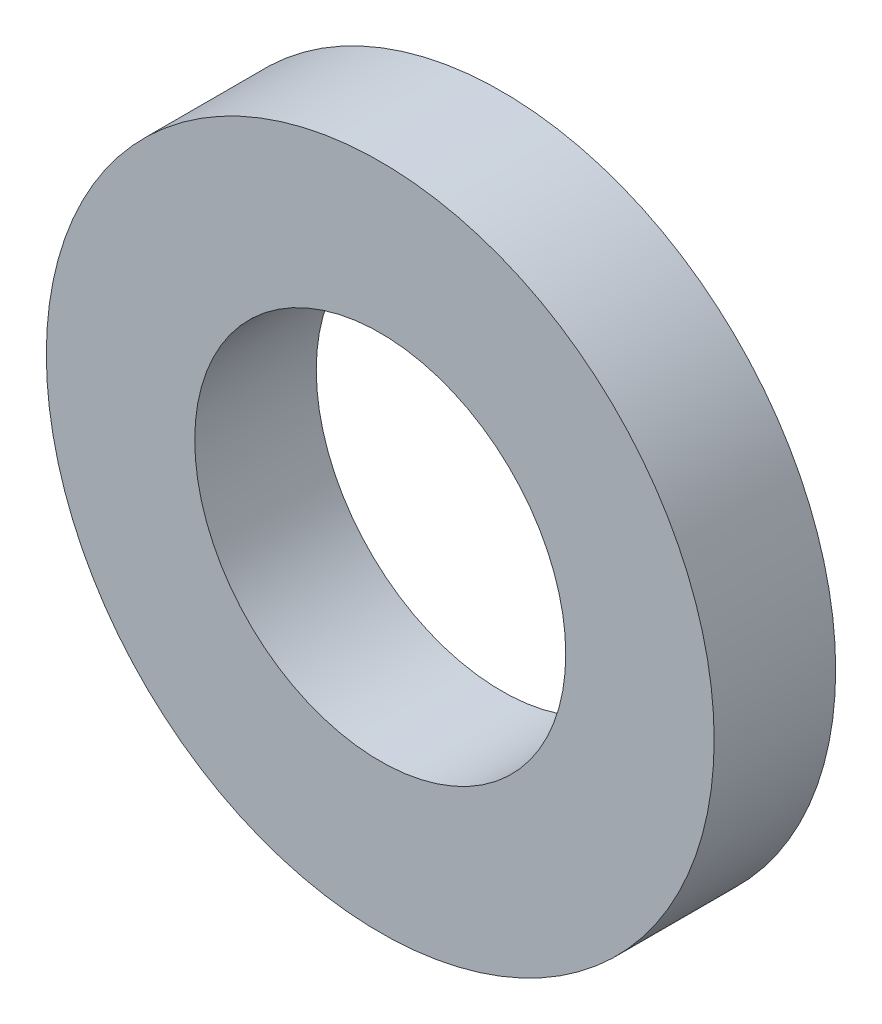
ISO-10303-21;
HEADER;
FILE_DESCRIPTION(('STEP AP214'),'2;1');
FILE_NAME('part.step','',(''),(''),'','','');
FILE_SCHEMA(('AUTOMOTIVE_DESIGN { 1 0 10303 214 1 1 1 1 }'));
ENDSEC;
DATA;
#1=APPLICATION_CONTEXT('core data for automotive mechanical design processes');
#2=APPLICATION_PROTOCOL_DEFINITION('international standard','automotive_design',2000,#1);
#3=PRODUCT_CONTEXT('',#1,'mechanical');
#4=PRODUCT('Part','Part','',(#3));
#5=PRODUCT_RELATED_PRODUCT_CATEGORY('part','',(#4));
#6=PRODUCT_DEFINITION_FORMATION('','',#4);
#7=PRODUCT_DEFINITION_CONTEXT('part definition',#1,'design');
#8=PRODUCT_DEFINITION('design','',#6,#7);
#9=PRODUCT_DEFINITION_SHAPE('','',#8);
#10=(LENGTH_UNIT() NAMED_UNIT(*) SI_UNIT(.MILLI.,.METRE.));
#11=(NAMED_UNIT(*) PLANE_ANGLE_UNIT() SI_UNIT($,.RADIAN.));
#12=(NAMED_UNIT(*) SI_UNIT($,.STERADIAN.) SOLID_ANGLE_UNIT());
#13=UNCERTAINTY_MEASURE_WITH_UNIT(LENGTH_MEASURE(1.E-05),#10,'distance_accuracy_value','');
#14=(GEOMETRIC_REPRESENTATION_CONTEXT(3) GLOBAL_UNCERTAINTY_ASSIGNED_CONTEXT((#13)) GLOBAL_UNIT_ASSIGNED_CONTEXT((#10,
#11,#12)) REPRESENTATION_CONTEXT('',''));
#15=CARTESIAN_POINT('',(0.,0.,0.));
#16=DIRECTION('',(0.,0.,1.));
#17=DIRECTION('',(1.,0.,0.));
#18=AXIS2_PLACEMENT_3D('',#15,#16,#17);
#19=CARTESIAN_POINT('',(0.,0.,0.81875));
#20=DIRECTION('',(0.,0.,1.));
#21=DIRECTION('',(1.,0.,0.));
#22=AXIS2_PLACEMENT_3D('',#19,#20,#21);
#23=PLANE('',#22);
#24=CARTESIAN_POINT('',(0.,0.,0.81875));
#25=DIRECTION('',(0.,0.,1.));
#26=DIRECTION('',(1.,0.,0.));
#27=AXIS2_PLACEMENT_3D('',#24,#25,#26);
#28=CIRCLE('',#27,4.5);
#29=CARTESIAN_POINT('',(4.5,0.,0.81875));
#30=VERTEX_POINT('',#29);
#31=EDGE_CURVE('E10',#30,#30,#28,.T.);
#32=ORIENTED_EDGE('',*,*,#31,.T.);
#33=EDGE_LOOP('',(#32));
#34=FACE_BOUND('',#33,.T.);
#35=CARTESIAN_POINT('',(0.,0.,0.81875));
#36=DIRECTION('',(0.,0.,1.));
#37=DIRECTION('',(1.,0.,0.));
#38=AXIS2_PLACEMENT_3D('',#35,#36,#37);
#39=CIRCLE('',#38,2.5);
#40=CARTESIAN_POINT('',(2.5,0.,0.81875));
#41=VERTEX_POINT('',#40);
#42=EDGE_CURVE('E54',#41,#41,#39,.T.);
#43=ORIENTED_EDGE('',*,*,#42,.F.);
#44=EDGE_LOOP('',(#43));
#45=FACE_BOUND('',#44,.T.);
#46=ADVANCED_FACE('F41',(#34,#45),#23,.T.);
#47=CARTESIAN_POINT('',(0.,0.,-0.81875));
#48=DIRECTION('',(0.,0.,1.));
#49=DIRECTION('',(1.,0.,0.));
#50=AXIS2_PLACEMENT_3D('',#47,#48,#49);
#51=PLANE('',#50);
#52=CARTESIAN_POINT('',(0.,0.,-0.81875));
#53=DIRECTION('',(0.,0.,1.));
#54=DIRECTION('',(1.,0.,0.));
#55=AXIS2_PLACEMENT_3D('',#52,#53,#54);
#56=CIRCLE('',#55,4.5);
#57=CARTESIAN_POINT('',(4.5,0.,-0.81875));
#58=VERTEX_POINT('',#57);
#59=EDGE_CURVE('E45',#58,#58,#56,.T.);
#60=ORIENTED_EDGE('',*,*,#59,.F.);
#61=EDGE_LOOP('',(#60));
#62=FACE_BOUND('',#61,.T.);
#63=CARTESIAN_POINT('',(0.,0.,-0.81875));
#64=DIRECTION('',(0.,0.,1.));
#65=DIRECTION('',(1.,0.,0.));
#66=AXIS2_PLACEMENT_3D('',#63,#64,#65);
#67=CIRCLE('',#66,2.5);
#68=CARTESIAN_POINT('',(2.5,0.,-0.81875));
#69=VERTEX_POINT('',#68);
#70=EDGE_CURVE('E56',#69,#69,#67,.T.);
#71=ORIENTED_EDGE('',*,*,#70,.T.);
#72=EDGE_LOOP('',(#71));
#73=FACE_BOUND('',#72,.T.);
#74=ADVANCED_FACE('F68',(#62,#73),#51,.F.);
#75=CARTESIAN_POINT('',(0.,0.,0.81875));
#76=DIRECTION('',(0.,0.,-1.));
#77=DIRECTION('',(-1.,0.,0.));
#78=AXIS2_PLACEMENT_3D('',#75,#76,#77);
#79=CYLINDRICAL_SURFACE('',#78,4.5);
#80=ORIENTED_EDGE('',*,*,#31,.F.);
#81=EDGE_LOOP('',(#80));
#82=FACE_BOUND('',#81,.T.);
#83=ORIENTED_EDGE('',*,*,#59,.T.);
#84=EDGE_LOOP('',(#83));
#85=FACE_BOUND('',#84,.T.);
#86=ADVANCED_FACE('F43',(#82,#85),#79,.T.);
#87=CARTESIAN_POINT('',(0.,0.,0.81875));
#88=DIRECTION('',(0.,0.,-1.));
#89=DIRECTION('',(-1.,0.,0.));
#90=AXIS2_PLACEMENT_3D('',#87,#88,#89);
#91=CYLINDRICAL_SURFACE('',#90,2.5);
#92=ORIENTED_EDGE('',*,*,#42,.T.);
#93=EDGE_LOOP('',(#92));
#94=FACE_BOUND('',#93,.T.);
#95=ORIENTED_EDGE('',*,*,#70,.F.);
#96=EDGE_LOOP('',(#95));
#97=FACE_BOUND('',#96,.T.);
#98=ADVANCED_FACE('F64',(#94,#97),#91,.F.);
#99=CLOSED_SHELL('',(#46,#74,#86,#98));
#100=MANIFOLD_SOLID_BREP('B2',#99);
#101=ADVANCED_BREP_SHAPE_REPRESENTATION('',(#18,#100),#14);
#102=SHAPE_DEFINITION_REPRESENTATION(#9,#101);
ENDSEC;
END-ISO-10303-21;
